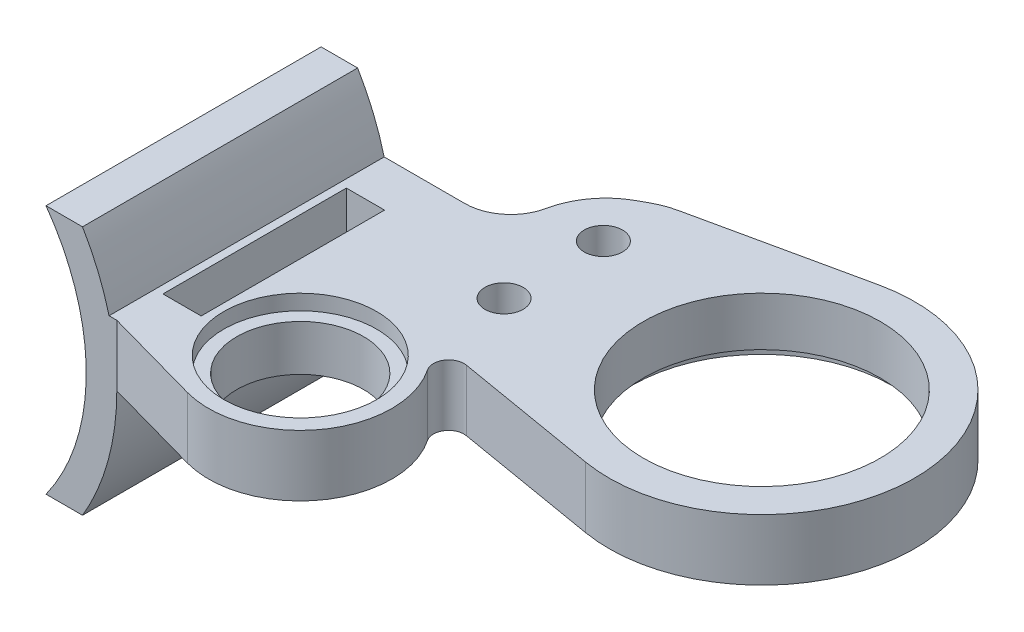
ISO-10303-21;
HEADER;
FILE_DESCRIPTION(('STEP AP214'),'2;1');
FILE_NAME('part.step','',(''),(''),'','','');
FILE_SCHEMA(('AUTOMOTIVE_DESIGN { 1 0 10303 214 1 1 1 1 }'));
ENDSEC;
DATA;
#1=APPLICATION_CONTEXT('core data for automotive mechanical design processes');
#2=APPLICATION_PROTOCOL_DEFINITION('international standard','automotive_design',2000,#1);
#3=PRODUCT_CONTEXT('',#1,'mechanical');
#4=PRODUCT('Part','Part','',(#3));
#5=PRODUCT_RELATED_PRODUCT_CATEGORY('part','',(#4));
#6=PRODUCT_DEFINITION_FORMATION('','',#4);
#7=PRODUCT_DEFINITION_CONTEXT('part definition',#1,'design');
#8=PRODUCT_DEFINITION('design','',#6,#7);
#9=PRODUCT_DEFINITION_SHAPE('','',#8);
#10=(LENGTH_UNIT() NAMED_UNIT(*) SI_UNIT(.MILLI.,.METRE.));
#11=(NAMED_UNIT(*) PLANE_ANGLE_UNIT() SI_UNIT($,.RADIAN.));
#12=(NAMED_UNIT(*) SI_UNIT($,.STERADIAN.) SOLID_ANGLE_UNIT());
#13=UNCERTAINTY_MEASURE_WITH_UNIT(LENGTH_MEASURE(1.E-05),#10,'distance_accuracy_value','');
#14=(GEOMETRIC_REPRESENTATION_CONTEXT(3) GLOBAL_UNCERTAINTY_ASSIGNED_CONTEXT((#13)) GLOBAL_UNIT_ASSIGNED_CONTEXT((#10,
#11,#12)) REPRESENTATION_CONTEXT('',''));
#15=CARTESIAN_POINT('',(0.,0.,0.));
#16=DIRECTION('',(0.,0.,1.));
#17=DIRECTION('',(1.,0.,0.));
#18=AXIS2_PLACEMENT_3D('',#15,#16,#17);
#19=CARTESIAN_POINT('',(24.,4.,14.));
#20=DIRECTION('',(0.,-1.,0.));
#21=DIRECTION('',(0.,0.,-1.));
#22=AXIS2_PLACEMENT_3D('',#19,#20,#21);
#23=CYLINDRICAL_SURFACE('',#22,4.15);
#24=CARTESIAN_POINT('',(24.,0.,14.));
#25=DIRECTION('',(0.,1.,0.));
#26=DIRECTION('',(0.,0.,1.));
#27=AXIS2_PLACEMENT_3D('',#24,#25,#26);
#28=CIRCLE('',#27,4.15);
#29=CARTESIAN_POINT('',(24.,0.,18.15));
#30=VERTEX_POINT('',#29);
#31=EDGE_CURVE('E213',#30,#30,#28,.T.);
#32=ORIENTED_EDGE('',*,*,#31,.F.);
#33=EDGE_LOOP('',(#32));
#34=FACE_BOUND('',#33,.T.);
#35=CARTESIAN_POINT('',(24.,3.,14.));
#36=DIRECTION('',(0.,1.,0.));
#37=DIRECTION('',(0.,0.,1.));
#38=AXIS2_PLACEMENT_3D('',#35,#36,#37);
#39=CIRCLE('',#38,4.15);
#40=CARTESIAN_POINT('',(24.,3.,18.15));
#41=VERTEX_POINT('',#40);
#42=EDGE_CURVE('E40',#41,#41,#39,.T.);
#43=ORIENTED_EDGE('',*,*,#42,.T.);
#44=EDGE_LOOP('',(#43));
#45=FACE_BOUND('',#44,.T.);
#46=ADVANCED_FACE('F36',(#34,#45),#23,.F.);
#47=CARTESIAN_POINT('',(41.0436910619089,4.,0.841595363012409));
#48=DIRECTION('',(0.,-1.,0.));
#49=DIRECTION('',(0.,0.,-1.));
#50=AXIS2_PLACEMENT_3D('',#47,#48,#49);
#51=CYLINDRICAL_SURFACE('',#50,7.75000000000001);
#52=CARTESIAN_POINT('',(41.0436910619089,4.,0.841595363012409));
#53=DIRECTION('',(0.,1.,0.));
#54=DIRECTION('',(0.,0.,1.));
#55=AXIS2_PLACEMENT_3D('',#52,#53,#54);
#56=CIRCLE('',#55,7.75000000000001);
#57=CARTESIAN_POINT('',(41.0436910619089,4.,8.59159536301242));
#58=VERTEX_POINT('',#57);
#59=EDGE_CURVE('E360',#58,#58,#56,.T.);
#60=ORIENTED_EDGE('',*,*,#59,.T.);
#61=EDGE_LOOP('',(#60));
#62=FACE_BOUND('',#61,.T.);
#63=CARTESIAN_POINT('',(41.0436910619089,0.8,0.841595363012409));
#64=DIRECTION('',(0.,-1.,0.));
#65=DIRECTION('',(0.,0.,-1.));
#66=AXIS2_PLACEMENT_3D('',#63,#64,#65);
#67=CIRCLE('',#66,7.75000000000001);
#68=CARTESIAN_POINT('',(41.0436910619089,0.8,-6.9084046369876));
#69=VERTEX_POINT('',#68);
#70=EDGE_CURVE('E339',#69,#69,#67,.T.);
#71=ORIENTED_EDGE('',*,*,#70,.T.);
#72=EDGE_LOOP('',(#71));
#73=FACE_BOUND('',#72,.T.);
#74=ADVANCED_FACE('F377',(#62,#73),#51,.F.);
#75=CARTESIAN_POINT('',(0.,0.,18.));
#76=DIRECTION('',(0.,0.,-1.));
#77=DIRECTION('',(-1.,0.,0.));
#78=AXIS2_PLACEMENT_3D('',#75,#76,#77);
#79=CYLINDRICAL_SURFACE('',#78,16.);
#80=DIRECTION('',(0.,0.,-1.));
#81=VECTOR('',#80,1.);
#82=CARTESIAN_POINT('',(16.,0.,18.));
#83=LINE('',#82,#81);
#84=CARTESIAN_POINT('',(16.,0.,18.));
#85=VERTEX_POINT('',#84);
#86=CARTESIAN_POINT('',(16.,0.,0.));
#87=VERTEX_POINT('',#86);
#88=EDGE_CURVE('E270',#85,#87,#83,.T.);
#89=ORIENTED_EDGE('',*,*,#88,.F.);
#90=CARTESIAN_POINT('',(0.,0.,18.));
#91=DIRECTION('',(0.,0.,1.));
#92=DIRECTION('',(-1.,0.,0.));
#93=AXIS2_PLACEMENT_3D('',#90,#91,#92);
#94=CIRCLE('',#93,16.);
#95=CARTESIAN_POINT('',(13.7549507235002,-8.17320809682969,18.));
#96=VERTEX_POINT('',#95);
#97=EDGE_CURVE('E284',#96,#85,#94,.T.);
#98=ORIENTED_EDGE('',*,*,#97,.F.);
#99=DIRECTION('',(0.,0.,-1.));
#100=VECTOR('',#99,1.);
#101=CARTESIAN_POINT('',(13.7549507235002,-8.17320809682969,18.));
#102=LINE('',#101,#100);
#103=CARTESIAN_POINT('',(13.7549507235002,-8.17320809682969,0.));
#104=VERTEX_POINT('',#103);
#105=EDGE_CURVE('E304',#96,#104,#102,.T.);
#106=ORIENTED_EDGE('',*,*,#105,.T.);
#107=CARTESIAN_POINT('',(0.,0.,0.));
#108=DIRECTION('',(0.,0.,1.));
#109=DIRECTION('',(-1.,0.,0.));
#110=AXIS2_PLACEMENT_3D('',#107,#108,#109);
#111=CIRCLE('',#110,16.);
#112=EDGE_CURVE('E295',#104,#87,#111,.T.);
#113=ORIENTED_EDGE('',*,*,#112,.T.);
#114=EDGE_LOOP('',(#89,#98,#106,#113));
#115=FACE_BOUND('',#114,.T.);
#116=ADVANCED_FACE('F458',(#115),#79,.T.);
#117=CARTESIAN_POINT('',(0.,0.,18.));
#118=DIRECTION('',(0.,0.,-1.));
#119=DIRECTION('',(-1.,0.,0.));
#120=AXIS2_PLACEMENT_3D('',#117,#118,#119);
#121=CYLINDRICAL_SURFACE('',#120,14.);
#122=CARTESIAN_POINT('',(0.,0.,0.));
#123=DIRECTION('',(0.,0.,-1.));
#124=DIRECTION('',(-1.,0.,0.));
#125=AXIS2_PLACEMENT_3D('',#122,#123,#124);
#126=CIRCLE('',#125,14.);
#127=CARTESIAN_POINT('',(11.3665592597724,8.17320809682969,0.));
#128=VERTEX_POINT('',#127);
#129=CARTESIAN_POINT('',(11.3665592597724,-8.17320809682969,0.));
#130=VERTEX_POINT('',#129);
#131=EDGE_CURVE('E276',#128,#130,#126,.T.);
#132=ORIENTED_EDGE('',*,*,#131,.T.);
#133=DIRECTION('',(0.,0.,-1.));
#134=VECTOR('',#133,1.);
#135=CARTESIAN_POINT('',(11.3665592597724,-8.17320809682969,18.));
#136=LINE('',#135,#134);
#137=CARTESIAN_POINT('',(11.3665592597724,-8.17320809682969,18.));
#138=VERTEX_POINT('',#137);
#139=EDGE_CURVE('E307',#138,#130,#136,.T.);
#140=ORIENTED_EDGE('',*,*,#139,.F.);
#141=CARTESIAN_POINT('',(0.,0.,18.));
#142=DIRECTION('',(0.,0.,-1.));
#143=DIRECTION('',(-1.,0.,0.));
#144=AXIS2_PLACEMENT_3D('',#141,#142,#143);
#145=CIRCLE('',#144,14.);
#146=CARTESIAN_POINT('',(11.3665592597724,8.17320809682969,18.));
#147=VERTEX_POINT('',#146);
#148=EDGE_CURVE('E277',#147,#138,#145,.T.);
#149=ORIENTED_EDGE('',*,*,#148,.F.);
#150=DIRECTION('',(0.,0.,-1.));
#151=VECTOR('',#150,1.);
#152=CARTESIAN_POINT('',(11.3665592597724,8.17320809682969,18.));
#153=LINE('',#152,#151);
#154=EDGE_CURVE('E289',#147,#128,#153,.T.);
#155=ORIENTED_EDGE('',*,*,#154,.T.);
#156=EDGE_LOOP('',(#132,#140,#149,#155));
#157=FACE_BOUND('',#156,.T.);
#158=ADVANCED_FACE('F470',(#157),#121,.F.);
#159=CARTESIAN_POINT('',(11.3665592597724,-8.17320809682969,18.));
#160=DIRECTION('',(0.,1.,0.));
#161=DIRECTION('',(-1.,0.,0.));
#162=AXIS2_PLACEMENT_3D('',#159,#160,#161);
#163=PLANE('',#162);
#164=DIRECTION('',(1.,0.,0.));
#165=VECTOR('',#164,1.);
#166=CARTESIAN_POINT('',(11.3665592597724,-8.17320809682969,0.));
#167=LINE('',#166,#165);
#168=EDGE_CURVE('E292',#130,#104,#167,.T.);
#169=ORIENTED_EDGE('',*,*,#168,.T.);
#170=ORIENTED_EDGE('',*,*,#105,.F.);
#171=DIRECTION('',(1.,0.,0.));
#172=VECTOR('',#171,1.);
#173=CARTESIAN_POINT('',(11.3665592597724,-8.17320809682969,18.));
#174=LINE('',#173,#172);
#175=EDGE_CURVE('E280',#138,#96,#174,.T.);
#176=ORIENTED_EDGE('',*,*,#175,.F.);
#177=ORIENTED_EDGE('',*,*,#139,.T.);
#178=EDGE_LOOP('',(#169,#170,#176,#177));
#179=FACE_BOUND('',#178,.T.);
#180=ADVANCED_FACE('F466',(#179),#163,.F.);
#181=CARTESIAN_POINT('',(15.4919333848297,4.,18.));
#182=VERTEX_POINT('',#181);
#183=CARTESIAN_POINT('',(13.7549507235002,8.1732080968297,18.));
#184=VERTEX_POINT('',#183);
#185=EDGE_CURVE('E283',#182,#184,#94,.T.);
#186=ORIENTED_EDGE('',*,*,#185,.F.);
#187=DIRECTION('',(0.,0.,-1.));
#188=VECTOR('',#187,1.);
#189=CARTESIAN_POINT('',(15.4919333848297,4.,18.));
#190=LINE('',#189,#188);
#191=CARTESIAN_POINT('',(15.4919333848297,4.,0.));
#192=VERTEX_POINT('',#191);
#193=EDGE_CURVE('E273',#182,#192,#190,.T.);
#194=ORIENTED_EDGE('',*,*,#193,.T.);
#195=CARTESIAN_POINT('',(13.7549507235002,8.1732080968297,0.));
#196=VERTEX_POINT('',#195);
#197=EDGE_CURVE('E294',#192,#196,#111,.T.);
#198=ORIENTED_EDGE('',*,*,#197,.T.);
#199=DIRECTION('',(0.,0.,-1.));
#200=VECTOR('',#199,1.);
#201=CARTESIAN_POINT('',(13.7549507235002,8.1732080968297,18.));
#202=LINE('',#201,#200);
#203=EDGE_CURVE('E301',#184,#196,#202,.T.);
#204=ORIENTED_EDGE('',*,*,#203,.F.);
#205=EDGE_LOOP('',(#186,#194,#198,#204));
#206=FACE_BOUND('',#205,.T.);
#207=ADVANCED_FACE('F478',(#206),#79,.T.);
#208=CARTESIAN_POINT('',(13.7549507235002,8.1732080968297,18.));
#209=DIRECTION('',(0.,-1.,0.));
#210=DIRECTION('',(1.,0.,0.));
#211=AXIS2_PLACEMENT_3D('',#208,#209,#210);
#212=PLANE('',#211);
#213=DIRECTION('',(-1.,0.,0.));
#214=VECTOR('',#213,1.);
#215=CARTESIAN_POINT('',(13.7549507235002,8.1732080968297,0.));
#216=LINE('',#215,#214);
#217=EDGE_CURVE('E281',#196,#128,#216,.T.);
#218=ORIENTED_EDGE('',*,*,#217,.T.);
#219=ORIENTED_EDGE('',*,*,#154,.F.);
#220=DIRECTION('',(-1.,0.,0.));
#221=VECTOR('',#220,1.);
#222=CARTESIAN_POINT('',(13.7549507235002,8.1732080968297,18.));
#223=LINE('',#222,#221);
#224=EDGE_CURVE('E287',#184,#147,#223,.T.);
#225=ORIENTED_EDGE('',*,*,#224,.F.);
#226=ORIENTED_EDGE('',*,*,#203,.T.);
#227=EDGE_LOOP('',(#218,#219,#225,#226));
#228=FACE_BOUND('',#227,.T.);
#229=ADVANCED_FACE('F474',(#228),#212,.F.);
#230=CARTESIAN_POINT('',(0.,0.,18.));
#231=DIRECTION('',(0.,0.,-1.));
#232=DIRECTION('',(-1.,0.,0.));
#233=AXIS2_PLACEMENT_3D('',#230,#231,#232);
#234=PLANE('',#233);
#235=ORIENTED_EDGE('',*,*,#97,.T.);
#236=DIRECTION('',(0.,-1.,0.));
#237=VECTOR('',#236,1.);
#238=CARTESIAN_POINT('',(16.,4.,18.));
#239=LINE('',#238,#237);
#240=CARTESIAN_POINT('',(16.,4.,18.));
#241=VERTEX_POINT('',#240);
#242=EDGE_CURVE('E265',#241,#85,#239,.T.);
#243=ORIENTED_EDGE('',*,*,#242,.F.);
#244=DIRECTION('',(1.,0.,0.));
#245=VECTOR('',#244,1.);
#246=CARTESIAN_POINT('',(16.,4.,18.));
#247=LINE('',#246,#245);
#248=EDGE_CURVE('E236',#182,#241,#247,.T.);
#249=ORIENTED_EDGE('',*,*,#248,.F.);
#250=ORIENTED_EDGE('',*,*,#185,.T.);
#251=ORIENTED_EDGE('',*,*,#224,.T.);
#252=ORIENTED_EDGE('',*,*,#148,.T.);
#253=ORIENTED_EDGE('',*,*,#175,.T.);
#254=EDGE_LOOP('',(#235,#243,#249,#250,#251,#252,#253));
#255=FACE_BOUND('',#254,.T.);
#256=ADVANCED_FACE('F461',(#255),#234,.F.);
#257=CARTESIAN_POINT('',(0.,0.,0.));
#258=DIRECTION('',(0.,0.,-1.));
#259=DIRECTION('',(-1.,0.,0.));
#260=AXIS2_PLACEMENT_3D('',#257,#258,#259);
#261=PLANE('',#260);
#262=DIRECTION('',(-1.,0.,0.));
#263=VECTOR('',#262,1.);
#264=CARTESIAN_POINT('',(16.,4.,0.));
#265=LINE('',#264,#263);
#266=CARTESIAN_POINT('',(20.7721283788565,4.,0.));
#267=VERTEX_POINT('',#266);
#268=EDGE_CURVE('E234',#267,#192,#265,.T.);
#269=ORIENTED_EDGE('',*,*,#268,.F.);
#270=DIRECTION('',(0.,1.,0.));
#271=VECTOR('',#270,1.);
#272=CARTESIAN_POINT('',(20.7721283788565,0.,0.));
#273=LINE('',#272,#271);
#274=CARTESIAN_POINT('',(20.7721283788565,0.,0.));
#275=VERTEX_POINT('',#274);
#276=EDGE_CURVE('E326',#267,#275,#273,.F.);
#277=ORIENTED_EDGE('',*,*,#276,.T.);
#278=DIRECTION('',(-1.,0.,0.));
#279=VECTOR('',#278,1.);
#280=CARTESIAN_POINT('',(14.8774753617501,0.,0.));
#281=LINE('',#280,#279);
#282=EDGE_CURVE('E253',#275,#87,#281,.T.);
#283=ORIENTED_EDGE('',*,*,#282,.T.);
#284=ORIENTED_EDGE('',*,*,#112,.F.);
#285=ORIENTED_EDGE('',*,*,#168,.F.);
#286=ORIENTED_EDGE('',*,*,#131,.F.);
#287=ORIENTED_EDGE('',*,*,#217,.F.);
#288=ORIENTED_EDGE('',*,*,#197,.F.);
#289=EDGE_LOOP('',(#269,#277,#283,#284,#285,#286,#287,#288));
#290=FACE_BOUND('',#289,.T.);
#291=ADVANCED_FACE('F393',(#290),#261,.T.);
#292=CARTESIAN_POINT('',(41.0436910619089,4.,0.841595363012409));
#293=DIRECTION('',(0.,1.,0.));
#294=DIRECTION('',(0.,0.,1.));
#295=AXIS2_PLACEMENT_3D('',#292,#293,#294);
#296=PLANE('',#295);
#297=CARTESIAN_POINT('',(24.,4.,14.));
#298=DIRECTION('',(0.,1.,0.));
#299=DIRECTION('',(0.,0.,1.));
#300=AXIS2_PLACEMENT_3D('',#297,#298,#299);
#301=CIRCLE('',#300,5.);
#302=CARTESIAN_POINT('',(24.,4.,19.));
#303=VERTEX_POINT('',#302);
#304=EDGE_CURVE('E356',#303,#303,#301,.T.);
#305=ORIENTED_EDGE('',*,*,#304,.F.);
#306=EDGE_LOOP('',(#305));
#307=FACE_BOUND('',#306,.T.);
#308=CARTESIAN_POINT('',(27.4261472305126,4.,-2.4084046369876));
#309=DIRECTION('',(0.,1.,0.));
#310=DIRECTION('',(0.,0.,1.));
#311=AXIS2_PLACEMENT_3D('',#308,#309,#310);
#312=CIRCLE('',#311,1.25);
#313=CARTESIAN_POINT('',(27.4261472305126,4.,-1.1584046369876));
#314=VERTEX_POINT('',#313);
#315=EDGE_CURVE('E346',#314,#314,#312,.T.);
#316=ORIENTED_EDGE('',*,*,#315,.F.);
#317=EDGE_LOOP('',(#316));
#318=FACE_BOUND('',#317,.T.);
#319=CARTESIAN_POINT('',(27.4261472305126,4.,4.0915953630124));
#320=DIRECTION('',(0.,1.,0.));
#321=DIRECTION('',(0.,0.,1.));
#322=AXIS2_PLACEMENT_3D('',#319,#320,#321);
#323=CIRCLE('',#322,1.25);
#324=CARTESIAN_POINT('',(27.4261472305126,4.,5.3415953630124));
#325=VERTEX_POINT('',#324);
#326=EDGE_CURVE('E365',#325,#325,#323,.T.);
#327=ORIENTED_EDGE('',*,*,#326,.F.);
#328=EDGE_LOOP('',(#327));
#329=FACE_BOUND('',#328,.T.);
#330=DIRECTION('',(1.,0.,0.));
#331=VECTOR('',#330,1.);
#332=CARTESIAN_POINT('',(16.0172878186826,4.,15.));
#333=LINE('',#332,#331);
#334=CARTESIAN_POINT('',(16.0172878186826,4.,15.));
#335=VERTEX_POINT('',#334);
#336=CARTESIAN_POINT('',(18.5172878186826,4.,15.));
#337=VERTEX_POINT('',#336);
#338=EDGE_CURVE('E189',#335,#337,#333,.T.);
#339=ORIENTED_EDGE('',*,*,#338,.F.);
#340=DIRECTION('',(0.,0.,1.));
#341=VECTOR('',#340,1.);
#342=CARTESIAN_POINT('',(16.0172878186826,4.,15.));
#343=LINE('',#342,#341);
#344=CARTESIAN_POINT('',(16.0172878186826,4.,3.));
#345=VERTEX_POINT('',#344);
#346=EDGE_CURVE('E179',#345,#335,#343,.T.);
#347=ORIENTED_EDGE('',*,*,#346,.F.);
#348=DIRECTION('',(-1.,0.,0.));
#349=VECTOR('',#348,1.);
#350=CARTESIAN_POINT('',(16.0172878186826,4.,3.));
#351=LINE('',#350,#349);
#352=CARTESIAN_POINT('',(18.5172878186826,4.,3.));
#353=VERTEX_POINT('',#352);
#354=EDGE_CURVE('E206',#353,#345,#351,.T.);
#355=ORIENTED_EDGE('',*,*,#354,.F.);
#356=DIRECTION('',(0.,0.,-1.));
#357=VECTOR('',#356,1.);
#358=CARTESIAN_POINT('',(18.5172878186826,4.,15.));
#359=LINE('',#358,#357);
#360=EDGE_CURVE('E204',#337,#353,#359,.T.);
#361=ORIENTED_EDGE('',*,*,#360,.F.);
#362=EDGE_LOOP('',(#339,#347,#355,#361));
#363=FACE_BOUND('',#362,.T.);
#364=ORIENTED_EDGE('',*,*,#59,.F.);
#365=EDGE_LOOP('',(#364));
#366=FACE_BOUND('',#365,.T.);
#367=DIRECTION('',(-0.878255172846923,0.,0.478192274475049));
#368=VECTOR('',#367,1.);
#369=CARTESIAN_POINT('',(23.6069693910656,4.,-4.35352831150779));
#370=LINE('',#369,#368);
#371=CARTESIAN_POINT('',(26.7969103608494,4.,-6.09038700012488));
#372=VERTEX_POINT('',#371);
#373=CARTESIAN_POINT('',(26.2160080186903,4.,-5.77409736035596));
#374=VERTEX_POINT('',#373);
#375=EDGE_CURVE('E231',#372,#374,#370,.T.);
#376=ORIENTED_EDGE('',*,*,#375,.T.);
#377=CARTESIAN_POINT('',(28.6069693910656,4.,-1.38282149612134));
#378=DIRECTION('',(0.,1.,0.));
#379=DIRECTION('',(0.,0.,1.));
#380=AXIS2_PLACEMENT_3D('',#377,#378,#379);
#381=CIRCLE('',#380,5.);
#382=CARTESIAN_POINT('',(23.7101937584349,4.,-2.3935580610455));
#383=VERTEX_POINT('',#382);
#384=EDGE_CURVE('E321',#374,#383,#381,.T.);
#385=ORIENTED_EDGE('',*,*,#384,.T.);
#386=CARTESIAN_POINT('',(20.7721283788565,4.,-3.));
#387=DIRECTION('',(0.,1.,0.));
#388=DIRECTION('',(0.,0.,1.));
#389=AXIS2_PLACEMENT_3D('',#386,#387,#388);
#390=CIRCLE('',#389,3.);
#391=EDGE_CURVE('E333',#383,#267,#390,.F.);
#392=ORIENTED_EDGE('',*,*,#391,.T.);
#393=ORIENTED_EDGE('',*,*,#268,.T.);
#394=ORIENTED_EDGE('',*,*,#193,.F.);
#395=ORIENTED_EDGE('',*,*,#248,.T.);
#396=DIRECTION('',(0.96332495807108,0.,0.268337520964459));
#397=VECTOR('',#396,1.);
#398=CARTESIAN_POINT('',(16.,4.,18.));
#399=LINE('',#398,#397);
#400=CARTESIAN_POINT('',(22.3899748742132,4.,19.7799497484265));
#401=VERTEX_POINT('',#400);
#402=EDGE_CURVE('E238',#241,#401,#399,.T.);
#403=ORIENTED_EDGE('',*,*,#402,.T.);
#404=CARTESIAN_POINT('',(24.,4.,14.));
#405=DIRECTION('',(0.,1.,0.));
#406=DIRECTION('',(0.,0.,-1.));
#407=AXIS2_PLACEMENT_3D('',#404,#405,#406);
#408=CIRCLE('',#407,5.99999999999999);
#409=CARTESIAN_POINT('',(28.9781965117284,4.,10.650737470634));
#410=VERTEX_POINT('',#409);
#411=EDGE_CURVE('E240',#401,#410,#408,.T.);
#412=ORIENTED_EDGE('',*,*,#411,.T.);
#413=CARTESIAN_POINT('',(29.8078959303498,4.,10.092527049073));
#414=DIRECTION('',(0.,1.,0.));
#415=DIRECTION('',(0.,0.,1.));
#416=AXIS2_PLACEMENT_3D('',#413,#414,#415);
#417=CIRCLE('',#416,1.);
#418=CARTESIAN_POINT('',(29.9751651109192,4.,9.10661578469289));
#419=VERTEX_POINT('',#418);
#420=EDGE_CURVE('E11',#410,#419,#417,.F.);
#421=ORIENTED_EDGE('',*,*,#420,.T.);
#422=DIRECTION('',(0.985911264380135,0.,0.167269180569416));
#423=VECTOR('',#422,1.);
#424=CARTESIAN_POINT('',(39.3709992562148,4.,10.7007080068138));
#425=LINE('',#424,#423);
#426=CARTESIAN_POINT('',(39.3709992562148,4.,10.7007080068138));
#427=VERTEX_POINT('',#426);
#428=EDGE_CURVE('E242',#419,#427,#425,.T.);
#429=ORIENTED_EDGE('',*,*,#428,.T.);
#430=CARTESIAN_POINT('',(41.0436910619089,4.,0.841595363012409));
#431=DIRECTION('',(0.,1.,0.));
#432=DIRECTION('',(0.,0.,1.));
#433=AXIS2_PLACEMENT_3D('',#430,#431,#432);
#434=CIRCLE('',#433,10.);
#435=CARTESIAN_POINT('',(38.9204967604142,4.,-8.9304078071723));
#436=VERTEX_POINT('',#435);
#437=EDGE_CURVE('E224',#427,#436,#434,.T.);
#438=ORIENTED_EDGE('',*,*,#437,.T.);
#439=DIRECTION('',(-0.977200317018471,0.,0.212319430149478));
#440=VECTOR('',#439,1.);
#441=CARTESIAN_POINT('',(27.4261472305126,4.,-6.43299381781367));
#442=LINE('',#441,#440);
#443=CARTESIAN_POINT('',(28.1262745824773,4.,-6.58511272098262));
#444=VERTEX_POINT('',#443);
#445=EDGE_CURVE('E227',#436,#444,#442,.T.);
#446=ORIENTED_EDGE('',*,*,#445,.T.);
#447=CARTESIAN_POINT('',(29.1878717332247,4.,-1.69911113589026));
#448=DIRECTION('',(0.,1.,0.));
#449=DIRECTION('',(0.,0.,1.));
#450=AXIS2_PLACEMENT_3D('',#447,#448,#449);
#451=CIRCLE('',#450,5.);
#452=EDGE_CURVE('E319',#444,#372,#451,.T.);
#453=ORIENTED_EDGE('',*,*,#452,.T.);
#454=EDGE_LOOP('',(#376,#385,#392,#393,#394,#395,#403,#412,#421,#429,#438,#446,#453));
#455=FACE_BOUND('',#454,.T.);
#456=ADVANCED_FACE('F201',(#307,#318,#329,#363,#366,#455),#296,.T.);
#457=CARTESIAN_POINT('',(41.0436910619089,0.,0.841595363012409));
#458=DIRECTION('',(0.,1.,0.));
#459=DIRECTION('',(0.,0.,1.));
#460=AXIS2_PLACEMENT_3D('',#457,#458,#459);
#461=PLANE('',#460);
#462=CARTESIAN_POINT('',(41.0436910619089,0.,0.841595363012409));
#463=DIRECTION('',(0.,-1.,0.));
#464=DIRECTION('',(0.,0.,-1.));
#465=AXIS2_PLACEMENT_3D('',#462,#463,#464);
#466=CIRCLE('',#465,8.50000000000003);
#467=CARTESIAN_POINT('',(41.0436910619089,0.,-7.65840463698762));
#468=VERTEX_POINT('',#467);
#469=EDGE_CURVE('E349',#468,#468,#466,.T.);
#470=ORIENTED_EDGE('',*,*,#469,.F.);
#471=EDGE_LOOP('',(#470));
#472=FACE_BOUND('',#471,.T.);
#473=DIRECTION('',(0.,0.,1.));
#474=VECTOR('',#473,1.);
#475=CARTESIAN_POINT('',(16.0172878186826,0.,15.));
#476=LINE('',#475,#474);
#477=CARTESIAN_POINT('',(16.0172878186826,0.,3.));
#478=VERTEX_POINT('',#477);
#479=CARTESIAN_POINT('',(16.0172878186826,0.,15.));
#480=VERTEX_POINT('',#479);
#481=EDGE_CURVE('E211',#478,#480,#476,.T.);
#482=ORIENTED_EDGE('',*,*,#481,.T.);
#483=DIRECTION('',(1.,0.,0.));
#484=VECTOR('',#483,1.);
#485=CARTESIAN_POINT('',(16.0172878186826,0.,15.));
#486=LINE('',#485,#484);
#487=CARTESIAN_POINT('',(18.5172878186826,0.,15.));
#488=VERTEX_POINT('',#487);
#489=EDGE_CURVE('E196',#480,#488,#486,.T.);
#490=ORIENTED_EDGE('',*,*,#489,.T.);
#491=DIRECTION('',(0.,0.,-1.));
#492=VECTOR('',#491,1.);
#493=CARTESIAN_POINT('',(18.5172878186826,0.,15.));
#494=LINE('',#493,#492);
#495=CARTESIAN_POINT('',(18.5172878186826,0.,3.));
#496=VERTEX_POINT('',#495);
#497=EDGE_CURVE('E215',#488,#496,#494,.T.);
#498=ORIENTED_EDGE('',*,*,#497,.T.);
#499=DIRECTION('',(-1.,0.,0.));
#500=VECTOR('',#499,1.);
#501=CARTESIAN_POINT('',(16.0172878186826,0.,3.));
#502=LINE('',#501,#500);
#503=EDGE_CURVE('E190',#496,#478,#502,.T.);
#504=ORIENTED_EDGE('',*,*,#503,.T.);
#505=EDGE_LOOP('',(#482,#490,#498,#504));
#506=FACE_BOUND('',#505,.T.);
#507=ORIENTED_EDGE('',*,*,#31,.T.);
#508=EDGE_LOOP('',(#507));
#509=FACE_BOUND('',#508,.T.);
#510=CARTESIAN_POINT('',(27.4261472305126,0.,4.0915953630124));
#511=DIRECTION('',(0.,1.,0.));
#512=DIRECTION('',(0.,0.,1.));
#513=AXIS2_PLACEMENT_3D('',#510,#511,#512);
#514=CIRCLE('',#513,1.25);
#515=CARTESIAN_POINT('',(27.4261472305126,0.,5.3415953630124));
#516=VERTEX_POINT('',#515);
#517=EDGE_CURVE('E364',#516,#516,#514,.T.);
#518=ORIENTED_EDGE('',*,*,#517,.T.);
#519=EDGE_LOOP('',(#518));
#520=FACE_BOUND('',#519,.T.);
#521=CARTESIAN_POINT('',(27.4261472305126,0.,-2.4084046369876));
#522=DIRECTION('',(0.,1.,0.));
#523=DIRECTION('',(0.,0.,1.));
#524=AXIS2_PLACEMENT_3D('',#521,#522,#523);
#525=CIRCLE('',#524,1.25);
#526=CARTESIAN_POINT('',(27.4261472305126,0.,-1.1584046369876));
#527=VERTEX_POINT('',#526);
#528=EDGE_CURVE('E341',#527,#527,#525,.T.);
#529=ORIENTED_EDGE('',*,*,#528,.T.);
#530=EDGE_LOOP('',(#529));
#531=FACE_BOUND('',#530,.T.);
#532=ORIENTED_EDGE('',*,*,#282,.F.);
#533=CARTESIAN_POINT('',(20.7721283788565,0.,-3.));
#534=DIRECTION('',(0.,1.,0.));
#535=DIRECTION('',(0.,0.,1.));
#536=AXIS2_PLACEMENT_3D('',#533,#534,#535);
#537=CIRCLE('',#536,3.);
#538=CARTESIAN_POINT('',(23.7101937584349,0.,-2.3935580610455));
#539=VERTEX_POINT('',#538);
#540=EDGE_CURVE('E331',#275,#539,#537,.T.);
#541=ORIENTED_EDGE('',*,*,#540,.T.);
#542=CARTESIAN_POINT('',(28.6069693910656,0.,-1.38282149612134));
#543=DIRECTION('',(0.,1.,0.));
#544=DIRECTION('',(0.,0.,1.));
#545=AXIS2_PLACEMENT_3D('',#542,#543,#544);
#546=CIRCLE('',#545,5.);
#547=CARTESIAN_POINT('',(26.2160080186903,0.,-5.77409736035596));
#548=VERTEX_POINT('',#547);
#549=EDGE_CURVE('E312',#539,#548,#546,.F.);
#550=ORIENTED_EDGE('',*,*,#549,.T.);
#551=DIRECTION('',(-0.878255172846923,0.,0.478192274475049));
#552=VECTOR('',#551,1.);
#553=CARTESIAN_POINT('',(23.6069693910656,0.,-4.35352831150779));
#554=LINE('',#553,#552);
#555=CARTESIAN_POINT('',(26.7969103608494,0.,-6.09038700012488));
#556=VERTEX_POINT('',#555);
#557=EDGE_CURVE('E250',#556,#548,#554,.T.);
#558=ORIENTED_EDGE('',*,*,#557,.F.);
#559=CARTESIAN_POINT('',(29.1878717332247,0.,-1.69911113589026));
#560=DIRECTION('',(0.,1.,0.));
#561=DIRECTION('',(0.,0.,1.));
#562=AXIS2_PLACEMENT_3D('',#559,#560,#561);
#563=CIRCLE('',#562,5.);
#564=CARTESIAN_POINT('',(28.1262745824773,0.,-6.58511272098262));
#565=VERTEX_POINT('',#564);
#566=EDGE_CURVE('E310',#556,#565,#563,.F.);
#567=ORIENTED_EDGE('',*,*,#566,.T.);
#568=DIRECTION('',(-0.977200317018471,0.,0.212319430149478));
#569=VECTOR('',#568,1.);
#570=CARTESIAN_POINT('',(27.4261472305126,0.,-6.43299381781367));
#571=LINE('',#570,#569);
#572=CARTESIAN_POINT('',(38.9204967604142,0.,-8.9304078071723));
#573=VERTEX_POINT('',#572);
#574=EDGE_CURVE('E247',#573,#565,#571,.T.);
#575=ORIENTED_EDGE('',*,*,#574,.F.);
#576=CARTESIAN_POINT('',(41.0436910619089,0.,0.841595363012409));
#577=DIRECTION('',(0.,1.,0.));
#578=DIRECTION('',(0.,0.,1.));
#579=AXIS2_PLACEMENT_3D('',#576,#577,#578);
#580=CIRCLE('',#579,10.);
#581=CARTESIAN_POINT('',(39.3709992562148,0.,10.7007080068138));
#582=VERTEX_POINT('',#581);
#583=EDGE_CURVE('E197',#582,#573,#580,.T.);
#584=ORIENTED_EDGE('',*,*,#583,.F.);
#585=DIRECTION('',(0.985911264380135,0.,0.167269180569416));
#586=VECTOR('',#585,1.);
#587=CARTESIAN_POINT('',(39.3709992562148,0.,10.7007080068138));
#588=LINE('',#587,#586);
#589=CARTESIAN_POINT('',(29.9751651109192,0.,9.10661578469289));
#590=VERTEX_POINT('',#589);
#591=EDGE_CURVE('E228',#590,#582,#588,.T.);
#592=ORIENTED_EDGE('',*,*,#591,.F.);
#593=CARTESIAN_POINT('',(29.8078959303498,0.,10.092527049073));
#594=DIRECTION('',(0.,1.,0.));
#595=DIRECTION('',(0.,0.,1.));
#596=AXIS2_PLACEMENT_3D('',#593,#594,#595);
#597=CIRCLE('',#596,1.);
#598=CARTESIAN_POINT('',(28.9781965117284,0.,10.650737470634));
#599=VERTEX_POINT('',#598);
#600=EDGE_CURVE('E45',#590,#599,#597,.T.);
#601=ORIENTED_EDGE('',*,*,#600,.T.);
#602=CARTESIAN_POINT('',(24.,0.,14.));
#603=DIRECTION('',(0.,1.,0.));
#604=DIRECTION('',(0.,0.,-1.));
#605=AXIS2_PLACEMENT_3D('',#602,#603,#604);
#606=CIRCLE('',#605,5.99999999999999);
#607=CARTESIAN_POINT('',(22.3899748742132,0.,19.7799497484265));
#608=VERTEX_POINT('',#607);
#609=EDGE_CURVE('E257',#608,#599,#606,.T.);
#610=ORIENTED_EDGE('',*,*,#609,.F.);
#611=DIRECTION('',(0.96332495807108,0.,0.268337520964459));
#612=VECTOR('',#611,1.);
#613=CARTESIAN_POINT('',(16.,0.,18.));
#614=LINE('',#613,#612);
#615=EDGE_CURVE('E255',#85,#608,#614,.T.);
#616=ORIENTED_EDGE('',*,*,#615,.F.);
#617=ORIENTED_EDGE('',*,*,#88,.T.);
#618=EDGE_LOOP('',(#532,#541,#550,#558,#567,#575,#584,#592,#601,#610,#616,#617));
#619=FACE_BOUND('',#618,.T.);
#620=ADVANCED_FACE('F372',(#472,#506,#509,#520,#531,#619),#461,.F.);
#621=CARTESIAN_POINT('',(41.0436910619089,4.,0.841595363012409));
#622=DIRECTION('',(0.,-1.,0.));
#623=DIRECTION('',(0.,0.,-1.));
#624=AXIS2_PLACEMENT_3D('',#621,#622,#623);
#625=CYLINDRICAL_SURFACE('',#624,10.);
#626=ORIENTED_EDGE('',*,*,#583,.T.);
#627=DIRECTION('',(0.,-1.,0.));
#628=VECTOR('',#627,1.);
#629=CARTESIAN_POINT('',(38.9204967604142,4.,-8.9304078071723));
#630=LINE('',#629,#628);
#631=EDGE_CURVE('E267',#436,#573,#630,.T.);
#632=ORIENTED_EDGE('',*,*,#631,.F.);
#633=ORIENTED_EDGE('',*,*,#437,.F.);
#634=DIRECTION('',(0.,-1.,0.));
#635=VECTOR('',#634,1.);
#636=CARTESIAN_POINT('',(39.3709992562148,4.,10.7007080068138));
#637=LINE('',#636,#635);
#638=EDGE_CURVE('E244',#427,#582,#637,.T.);
#639=ORIENTED_EDGE('',*,*,#638,.T.);
#640=EDGE_LOOP('',(#626,#632,#633,#639));
#641=FACE_BOUND('',#640,.T.);
#642=ADVANCED_FACE('F408',(#641),#625,.T.);
#643=CARTESIAN_POINT('',(27.4261472305126,4.,-6.43299381781367));
#644=DIRECTION('',(0.212319430149478,0.,0.977200317018471));
#645=DIRECTION('',(0.977200317018471,0.,-0.212319430149478));
#646=AXIS2_PLACEMENT_3D('',#643,#644,#645);
#647=PLANE('',#646);
#648=ORIENTED_EDGE('',*,*,#574,.T.);
#649=DIRECTION('',(0.,-1.,0.));
#650=VECTOR('',#649,1.);
#651=CARTESIAN_POINT('',(28.1262745824773,4.,-6.58511272098262));
#652=LINE('',#651,#650);
#653=EDGE_CURVE('E324',#565,#444,#652,.F.);
#654=ORIENTED_EDGE('',*,*,#653,.T.);
#655=ORIENTED_EDGE('',*,*,#445,.F.);
#656=ORIENTED_EDGE('',*,*,#631,.T.);
#657=EDGE_LOOP('',(#648,#654,#655,#656));
#658=FACE_BOUND('',#657,.T.);
#659=ADVANCED_FACE('F441',(#658),#647,.F.);
#660=CARTESIAN_POINT('',(23.6069693910656,4.,-4.35352831150779));
#661=DIRECTION('',(0.478192274475049,0.,0.878255172846923));
#662=DIRECTION('',(0.878255172846924,0.,-0.478192274475049));
#663=AXIS2_PLACEMENT_3D('',#660,#661,#662);
#664=PLANE('',#663);
#665=ORIENTED_EDGE('',*,*,#557,.T.);
#666=DIRECTION('',(0.,-1.,0.));
#667=VECTOR('',#666,1.);
#668=CARTESIAN_POINT('',(26.2160080186903,4.,-5.77409736035596));
#669=LINE('',#668,#667);
#670=EDGE_CURVE('E317',#548,#374,#669,.F.);
#671=ORIENTED_EDGE('',*,*,#670,.T.);
#672=ORIENTED_EDGE('',*,*,#375,.F.);
#673=DIRECTION('',(0.,-1.,0.));
#674=VECTOR('',#673,1.);
#675=CARTESIAN_POINT('',(26.7969103608494,4.,-6.09038700012488));
#676=LINE('',#675,#674);
#677=EDGE_CURVE('E314',#372,#556,#676,.T.);
#678=ORIENTED_EDGE('',*,*,#677,.T.);
#679=EDGE_LOOP('',(#665,#671,#672,#678));
#680=FACE_BOUND('',#679,.T.);
#681=ADVANCED_FACE('F434',(#680),#664,.F.);
#682=CARTESIAN_POINT('',(16.,4.,18.));
#683=DIRECTION('',(0.268337520964459,0.,-0.96332495807108));
#684=DIRECTION('',(-0.96332495807108,0.,-0.268337520964459));
#685=AXIS2_PLACEMENT_3D('',#682,#683,#684);
#686=PLANE('',#685);
#687=ORIENTED_EDGE('',*,*,#615,.T.);
#688=DIRECTION('',(0.,-1.,0.));
#689=VECTOR('',#688,1.);
#690=CARTESIAN_POINT('',(22.3899748742132,4.,19.7799497484265));
#691=LINE('',#690,#689);
#692=EDGE_CURVE('E262',#401,#608,#691,.T.);
#693=ORIENTED_EDGE('',*,*,#692,.F.);
#694=ORIENTED_EDGE('',*,*,#402,.F.);
#695=ORIENTED_EDGE('',*,*,#242,.T.);
#696=EDGE_LOOP('',(#687,#693,#694,#695));
#697=FACE_BOUND('',#696,.T.);
#698=ADVANCED_FACE('F516',(#697),#686,.F.);
#699=CARTESIAN_POINT('',(24.,4.,14.));
#700=DIRECTION('',(0.,-1.,0.));
#701=DIRECTION('',(0.,0.,-1.));
#702=AXIS2_PLACEMENT_3D('',#699,#700,#701);
#703=CYLINDRICAL_SURFACE('',#702,5.99999999999999);
#704=ORIENTED_EDGE('',*,*,#609,.T.);
#705=DIRECTION('',(0.,-1.,0.));
#706=VECTOR('',#705,1.);
#707=CARTESIAN_POINT('',(28.9781965117284,4.,10.650737470634));
#708=LINE('',#707,#706);
#709=EDGE_CURVE('E53',#599,#410,#708,.F.);
#710=ORIENTED_EDGE('',*,*,#709,.T.);
#711=ORIENTED_EDGE('',*,*,#411,.F.);
#712=ORIENTED_EDGE('',*,*,#692,.T.);
#713=EDGE_LOOP('',(#704,#710,#711,#712));
#714=FACE_BOUND('',#713,.T.);
#715=ADVANCED_FACE('F454',(#714),#703,.T.);
#716=CARTESIAN_POINT('',(39.3709992562148,4.,10.7007080068138));
#717=DIRECTION('',(0.167269180569416,0.,-0.985911264380135));
#718=DIRECTION('',(-0.985911264380135,0.,-0.167269180569416));
#719=AXIS2_PLACEMENT_3D('',#716,#717,#718);
#720=PLANE('',#719);
#721=ORIENTED_EDGE('',*,*,#428,.F.);
#722=DIRECTION('',(0.,1.,0.));
#723=VECTOR('',#722,1.);
#724=CARTESIAN_POINT('',(29.9751651109192,0.,9.10661578469289));
#725=LINE('',#724,#723);
#726=EDGE_CURVE('E335',#419,#590,#725,.F.);
#727=ORIENTED_EDGE('',*,*,#726,.T.);
#728=ORIENTED_EDGE('',*,*,#591,.T.);
#729=ORIENTED_EDGE('',*,*,#638,.F.);
#730=EDGE_LOOP('',(#721,#727,#728,#729));
#731=FACE_BOUND('',#730,.T.);
#732=ADVANCED_FACE('F448',(#731),#720,.F.);
#733=CARTESIAN_POINT('',(16.0172878186826,4.,15.));
#734=DIRECTION('',(1.,0.,0.));
#735=DIRECTION('',(0.,0.,-1.));
#736=AXIS2_PLACEMENT_3D('',#733,#734,#735);
#737=PLANE('',#736);
#738=ORIENTED_EDGE('',*,*,#481,.F.);
#739=DIRECTION('',(0.,-1.,0.));
#740=VECTOR('',#739,1.);
#741=CARTESIAN_POINT('',(16.0172878186826,4.,3.));
#742=LINE('',#741,#740);
#743=EDGE_CURVE('E185',#345,#478,#742,.T.);
#744=ORIENTED_EDGE('',*,*,#743,.F.);
#745=ORIENTED_EDGE('',*,*,#346,.T.);
#746=DIRECTION('',(0.,-1.,0.));
#747=VECTOR('',#746,1.);
#748=CARTESIAN_POINT('',(16.0172878186826,4.,15.));
#749=LINE('',#748,#747);
#750=EDGE_CURVE('E182',#335,#480,#749,.T.);
#751=ORIENTED_EDGE('',*,*,#750,.T.);
#752=EDGE_LOOP('',(#738,#744,#745,#751));
#753=FACE_BOUND('',#752,.T.);
#754=ADVANCED_FACE('F181',(#753),#737,.T.);
#755=CARTESIAN_POINT('',(16.0172878186826,4.,15.));
#756=DIRECTION('',(0.,0.,-1.));
#757=DIRECTION('',(-1.,0.,0.));
#758=AXIS2_PLACEMENT_3D('',#755,#756,#757);
#759=PLANE('',#758);
#760=ORIENTED_EDGE('',*,*,#489,.F.);
#761=ORIENTED_EDGE('',*,*,#750,.F.);
#762=ORIENTED_EDGE('',*,*,#338,.T.);
#763=DIRECTION('',(0.,-1.,0.));
#764=VECTOR('',#763,1.);
#765=CARTESIAN_POINT('',(18.5172878186826,4.,15.));
#766=LINE('',#765,#764);
#767=EDGE_CURVE('E198',#337,#488,#766,.T.);
#768=ORIENTED_EDGE('',*,*,#767,.T.);
#769=EDGE_LOOP('',(#760,#761,#762,#768));
#770=FACE_BOUND('',#769,.T.);
#771=ADVANCED_FACE('F193',(#770),#759,.T.);
#772=CARTESIAN_POINT('',(18.5172878186826,4.,15.));
#773=DIRECTION('',(-1.,0.,0.));
#774=DIRECTION('',(0.,0.,1.));
#775=AXIS2_PLACEMENT_3D('',#772,#773,#774);
#776=PLANE('',#775);
#777=ORIENTED_EDGE('',*,*,#497,.F.);
#778=ORIENTED_EDGE('',*,*,#767,.F.);
#779=ORIENTED_EDGE('',*,*,#360,.T.);
#780=DIRECTION('',(0.,-1.,0.));
#781=VECTOR('',#780,1.);
#782=CARTESIAN_POINT('',(18.5172878186826,4.,3.));
#783=LINE('',#782,#781);
#784=EDGE_CURVE('E221',#353,#496,#783,.T.);
#785=ORIENTED_EDGE('',*,*,#784,.T.);
#786=EDGE_LOOP('',(#777,#778,#779,#785));
#787=FACE_BOUND('',#786,.T.);
#788=ADVANCED_FACE('F503',(#787),#776,.T.);
#789=CARTESIAN_POINT('',(16.0172878186826,4.,3.));
#790=DIRECTION('',(0.,0.,1.));
#791=DIRECTION('',(1.,0.,0.));
#792=AXIS2_PLACEMENT_3D('',#789,#790,#791);
#793=PLANE('',#792);
#794=ORIENTED_EDGE('',*,*,#503,.F.);
#795=ORIENTED_EDGE('',*,*,#784,.F.);
#796=ORIENTED_EDGE('',*,*,#354,.T.);
#797=ORIENTED_EDGE('',*,*,#743,.T.);
#798=EDGE_LOOP('',(#794,#795,#796,#797));
#799=FACE_BOUND('',#798,.T.);
#800=ADVANCED_FACE('F403',(#799),#793,.T.);
#801=CARTESIAN_POINT('',(27.4261472305126,4.,4.0915953630124));
#802=DIRECTION('',(0.,-1.,0.));
#803=DIRECTION('',(0.,0.,-1.));
#804=AXIS2_PLACEMENT_3D('',#801,#802,#803);
#805=CYLINDRICAL_SURFACE('',#804,1.25);
#806=ORIENTED_EDGE('',*,*,#326,.T.);
#807=EDGE_LOOP('',(#806));
#808=FACE_BOUND('',#807,.T.);
#809=ORIENTED_EDGE('',*,*,#517,.F.);
#810=EDGE_LOOP('',(#809));
#811=FACE_BOUND('',#810,.T.);
#812=ADVANCED_FACE('F399',(#808,#811),#805,.F.);
#813=CARTESIAN_POINT('',(27.4261472305126,4.,-2.4084046369876));
#814=DIRECTION('',(0.,-1.,0.));
#815=DIRECTION('',(0.,0.,-1.));
#816=AXIS2_PLACEMENT_3D('',#813,#814,#815);
#817=CYLINDRICAL_SURFACE('',#816,1.25);
#818=ORIENTED_EDGE('',*,*,#315,.T.);
#819=EDGE_LOOP('',(#818));
#820=FACE_BOUND('',#819,.T.);
#821=ORIENTED_EDGE('',*,*,#528,.F.);
#822=EDGE_LOOP('',(#821));
#823=FACE_BOUND('',#822,.T.);
#824=ADVANCED_FACE('F402',(#820,#823),#817,.F.);
#825=CARTESIAN_POINT('',(28.6069693910656,4.,-1.38282149612134));
#826=DIRECTION('',(0.,-1.,0.));
#827=DIRECTION('',(0.,0.,-1.));
#828=AXIS2_PLACEMENT_3D('',#825,#826,#827);
#829=CYLINDRICAL_SURFACE('',#828,5.);
#830=ORIENTED_EDGE('',*,*,#549,.F.);
#831=DIRECTION('',(0.,-1.,0.));
#832=VECTOR('',#831,1.);
#833=CARTESIAN_POINT('',(23.7101937584349,4.,-2.3935580610455));
#834=LINE('',#833,#832);
#835=EDGE_CURVE('E329',#539,#383,#834,.F.);
#836=ORIENTED_EDGE('',*,*,#835,.T.);
#837=ORIENTED_EDGE('',*,*,#384,.F.);
#838=ORIENTED_EDGE('',*,*,#670,.F.);
#839=EDGE_LOOP('',(#830,#836,#837,#838));
#840=FACE_BOUND('',#839,.T.);
#841=ADVANCED_FACE('F427',(#840),#829,.T.);
#842=CARTESIAN_POINT('',(29.1878717332247,4.,-1.69911113589026));
#843=DIRECTION('',(0.,-1.,0.));
#844=DIRECTION('',(0.,0.,-1.));
#845=AXIS2_PLACEMENT_3D('',#842,#843,#844);
#846=CYLINDRICAL_SURFACE('',#845,5.);
#847=ORIENTED_EDGE('',*,*,#452,.F.);
#848=ORIENTED_EDGE('',*,*,#653,.F.);
#849=ORIENTED_EDGE('',*,*,#566,.F.);
#850=ORIENTED_EDGE('',*,*,#677,.F.);
#851=EDGE_LOOP('',(#847,#848,#849,#850));
#852=FACE_BOUND('',#851,.T.);
#853=ADVANCED_FACE('F437',(#852),#846,.T.);
#854=CARTESIAN_POINT('',(20.7721283788565,4.,-3.));
#855=DIRECTION('',(0.,-1.,0.));
#856=DIRECTION('',(0.,0.,-1.));
#857=AXIS2_PLACEMENT_3D('',#854,#855,#856);
#858=CYLINDRICAL_SURFACE('',#857,3.);
#859=ORIENTED_EDGE('',*,*,#391,.F.);
#860=ORIENTED_EDGE('',*,*,#835,.F.);
#861=ORIENTED_EDGE('',*,*,#540,.F.);
#862=ORIENTED_EDGE('',*,*,#276,.F.);
#863=EDGE_LOOP('',(#859,#860,#861,#862));
#864=FACE_BOUND('',#863,.T.);
#865=ADVANCED_FACE('F423',(#864),#858,.F.);
#866=CARTESIAN_POINT('',(29.8078959303498,4.,10.092527049073));
#867=DIRECTION('',(0.,-1.,0.));
#868=DIRECTION('',(0.,0.,-1.));
#869=AXIS2_PLACEMENT_3D('',#866,#867,#868);
#870=CYLINDRICAL_SURFACE('',#869,1.);
#871=ORIENTED_EDGE('',*,*,#420,.F.);
#872=ORIENTED_EDGE('',*,*,#709,.F.);
#873=ORIENTED_EDGE('',*,*,#600,.F.);
#874=ORIENTED_EDGE('',*,*,#726,.F.);
#875=EDGE_LOOP('',(#871,#872,#873,#874));
#876=FACE_BOUND('',#875,.T.);
#877=ADVANCED_FACE('F38',(#876),#870,.F.);
#878=CARTESIAN_POINT('',(41.0436910619089,0.8,0.841595363012409));
#879=DIRECTION('',(0.,-1.,0.));
#880=DIRECTION('',(0.,0.,-1.));
#881=AXIS2_PLACEMENT_3D('',#878,#879,#880);
#882=CYLINDRICAL_SURFACE('',#881,8.50000000000003);
#883=CARTESIAN_POINT('',(41.0436910619089,0.8,0.841595363012409));
#884=DIRECTION('',(0.,-1.,0.));
#885=DIRECTION('',(0.,0.,-1.));
#886=AXIS2_PLACEMENT_3D('',#883,#884,#885);
#887=CIRCLE('',#886,8.50000000000003);
#888=CARTESIAN_POINT('',(41.0436910619089,0.8,-7.65840463698762));
#889=VERTEX_POINT('',#888);
#890=EDGE_CURVE('E342',#889,#889,#887,.T.);
#891=ORIENTED_EDGE('',*,*,#890,.F.);
#892=EDGE_LOOP('',(#891));
#893=FACE_BOUND('',#892,.T.);
#894=ORIENTED_EDGE('',*,*,#469,.T.);
#895=EDGE_LOOP('',(#894));
#896=FACE_BOUND('',#895,.T.);
#897=ADVANCED_FACE('F616',(#893,#896),#882,.F.);
#898=CARTESIAN_POINT('',(41.0436910619089,0.8,0.841595363012409));
#899=DIRECTION('',(0.,-1.,0.));
#900=DIRECTION('',(0.,0.,-1.));
#901=AXIS2_PLACEMENT_3D('',#898,#899,#900);
#902=PLANE('',#901);
#903=ORIENTED_EDGE('',*,*,#70,.F.);
#904=EDGE_LOOP('',(#903));
#905=FACE_BOUND('',#904,.T.);
#906=ORIENTED_EDGE('',*,*,#890,.T.);
#907=EDGE_LOOP('',(#906));
#908=FACE_BOUND('',#907,.T.);
#909=ADVANCED_FACE('F621',(#905,#908),#902,.T.);
#910=CARTESIAN_POINT('',(24.,3.,14.));
#911=DIRECTION('',(0.,1.,0.));
#912=DIRECTION('',(0.,0.,1.));
#913=AXIS2_PLACEMENT_3D('',#910,#911,#912);
#914=CYLINDRICAL_SURFACE('',#913,5.);
#915=CARTESIAN_POINT('',(24.,3.,14.));
#916=DIRECTION('',(0.,1.,0.));
#917=DIRECTION('',(0.,0.,1.));
#918=AXIS2_PLACEMENT_3D('',#915,#916,#917);
#919=CIRCLE('',#918,5.);
#920=CARTESIAN_POINT('',(24.,3.,19.));
#921=VERTEX_POINT('',#920);
#922=EDGE_CURVE('E382',#921,#921,#919,.T.);
#923=ORIENTED_EDGE('',*,*,#922,.F.);
#924=EDGE_LOOP('',(#923));
#925=FACE_BOUND('',#924,.T.);
#926=ORIENTED_EDGE('',*,*,#304,.T.);
#927=EDGE_LOOP('',(#926));
#928=FACE_BOUND('',#927,.T.);
#929=ADVANCED_FACE('F389',(#925,#928),#914,.F.);
#930=CARTESIAN_POINT('',(24.,3.,14.));
#931=DIRECTION('',(0.,1.,0.));
#932=DIRECTION('',(0.,0.,1.));
#933=AXIS2_PLACEMENT_3D('',#930,#931,#932);
#934=PLANE('',#933);
#935=ORIENTED_EDGE('',*,*,#42,.F.);
#936=EDGE_LOOP('',(#935));
#937=FACE_BOUND('',#936,.T.);
#938=ORIENTED_EDGE('',*,*,#922,.T.);
#939=EDGE_LOOP('',(#938));
#940=FACE_BOUND('',#939,.T.);
#941=ADVANCED_FACE('F634',(#937,#940),#934,.T.);
#942=CLOSED_SHELL('',(#46,#74,#116,#158,#180,#207,#229,#256,#291,#456,#620,#642,#659,#681,#698,
#715,#732,#754,#771,#788,#800,#812,#824,#841,#853,#865,#877,#897,#909,#929,#941));
#943=MANIFOLD_SOLID_BREP('B2',#942);
#944=ADVANCED_BREP_SHAPE_REPRESENTATION('',(#18,#943),#14);
#945=SHAPE_DEFINITION_REPRESENTATION(#9,#944);
ENDSEC;
END-ISO-10303-21;
